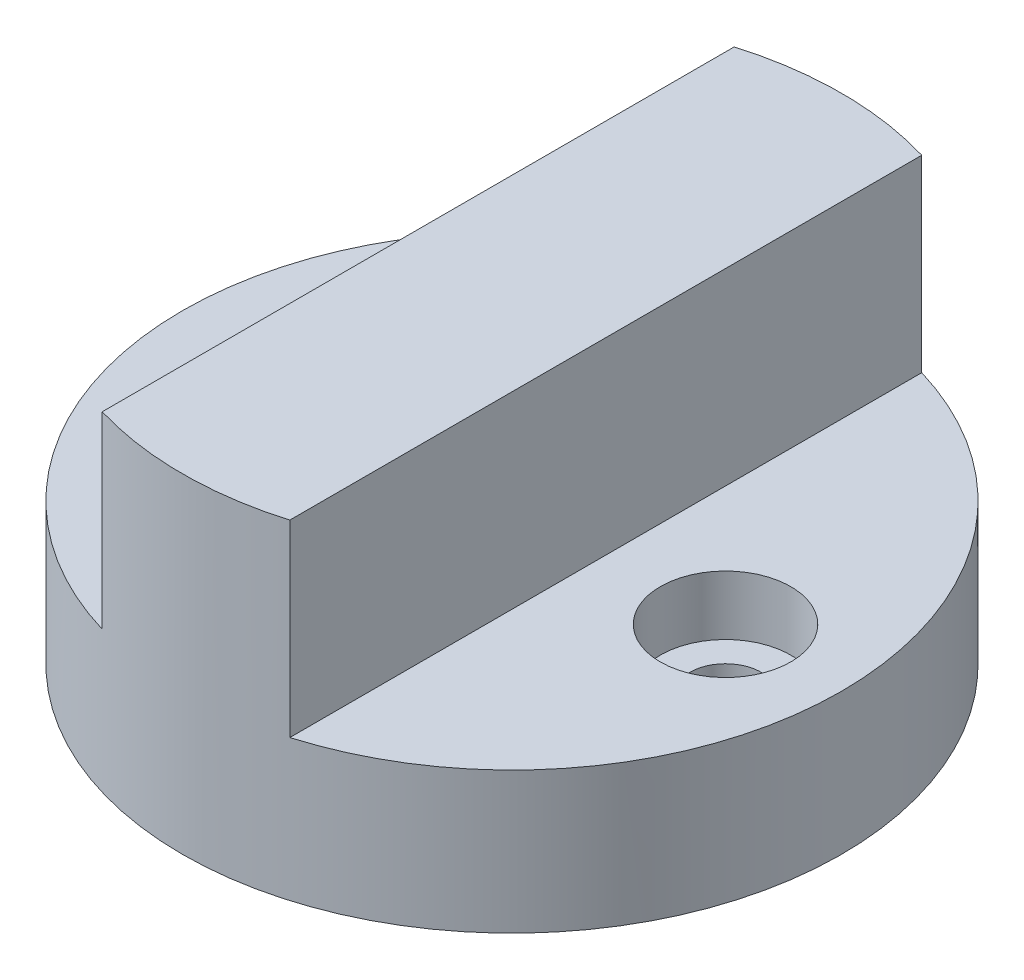
ISO-10303-21;
HEADER;
FILE_DESCRIPTION(('STEP AP214'),'2;1');
FILE_NAME('part.step','',(''),(''),'','','');
FILE_SCHEMA(('AUTOMOTIVE_DESIGN { 1 0 10303 214 1 1 1 1 }'));
ENDSEC;
DATA;
#1=APPLICATION_CONTEXT('core data for automotive mechanical design processes');
#2=APPLICATION_PROTOCOL_DEFINITION('international standard','automotive_design',2000,#1);
#3=PRODUCT_CONTEXT('',#1,'mechanical');
#4=PRODUCT('Part','Part','',(#3));
#5=PRODUCT_RELATED_PRODUCT_CATEGORY('part','',(#4));
#6=PRODUCT_DEFINITION_FORMATION('','',#4);
#7=PRODUCT_DEFINITION_CONTEXT('part definition',#1,'design');
#8=PRODUCT_DEFINITION('design','',#6,#7);
#9=PRODUCT_DEFINITION_SHAPE('','',#8);
#10=(LENGTH_UNIT() NAMED_UNIT(*) SI_UNIT(.MILLI.,.METRE.));
#11=(NAMED_UNIT(*) PLANE_ANGLE_UNIT() SI_UNIT($,.RADIAN.));
#12=(NAMED_UNIT(*) SI_UNIT($,.STERADIAN.) SOLID_ANGLE_UNIT());
#13=UNCERTAINTY_MEASURE_WITH_UNIT(LENGTH_MEASURE(1.E-05),#10,'distance_accuracy_value','');
#14=(GEOMETRIC_REPRESENTATION_CONTEXT(3) GLOBAL_UNCERTAINTY_ASSIGNED_CONTEXT((#13)) GLOBAL_UNIT_ASSIGNED_CONTEXT((#10,
#11,#12)) REPRESENTATION_CONTEXT('',''));
#15=CARTESIAN_POINT('',(0.,0.,0.));
#16=DIRECTION('',(0.,0.,1.));
#17=DIRECTION('',(1.,0.,0.));
#18=AXIS2_PLACEMENT_3D('',#15,#16,#17);
#19=CARTESIAN_POINT('',(0.,11.1125,0.));
#20=DIRECTION('',(0.,-1.,0.));
#21=DIRECTION('',(0.,0.,-1.));
#22=AXIS2_PLACEMENT_3D('',#19,#20,#21);
#23=CYLINDRICAL_SURFACE('',#22,11.1125);
#24=CARTESIAN_POINT('',(0.,11.1125,0.));
#25=DIRECTION('',(0.,1.,0.));
#26=DIRECTION('',(0.,0.,1.));
#27=AXIS2_PLACEMENT_3D('',#24,#25,#26);
#28=CIRCLE('',#27,11.1125);
#29=CARTESIAN_POINT('',(3.1623,11.1125,-10.6530519082561));
#30=VERTEX_POINT('',#29);
#31=CARTESIAN_POINT('',(-3.1623,11.1125,-10.6530519082561));
#32=VERTEX_POINT('',#31);
#33=EDGE_CURVE('E41',#30,#32,#28,.T.);
#34=ORIENTED_EDGE('',*,*,#33,.F.);
#35=DIRECTION('',(0.,1.,0.));
#36=VECTOR('',#35,1.);
#37=CARTESIAN_POINT('',(3.1623,4.7625,-10.6530519082561));
#38=LINE('',#37,#36);
#39=CARTESIAN_POINT('',(3.1623,4.7625,-10.6530519082561));
#40=VERTEX_POINT('',#39);
#41=EDGE_CURVE('E48',#40,#30,#38,.T.);
#42=ORIENTED_EDGE('',*,*,#41,.F.);
#43=CARTESIAN_POINT('',(0.,4.7625,0.));
#44=DIRECTION('',(0.,1.,0.));
#45=DIRECTION('',(0.,0.,-1.));
#46=AXIS2_PLACEMENT_3D('',#43,#44,#45);
#47=CIRCLE('',#46,11.1125);
#48=CARTESIAN_POINT('',(3.1623,4.7625,10.6530519082561));
#49=VERTEX_POINT('',#48);
#50=EDGE_CURVE('E77',#49,#40,#47,.T.);
#51=ORIENTED_EDGE('',*,*,#50,.F.);
#52=DIRECTION('',(0.,1.,0.));
#53=VECTOR('',#52,1.);
#54=CARTESIAN_POINT('',(3.1623,4.7625,10.6530519082561));
#55=LINE('',#54,#53);
#56=CARTESIAN_POINT('',(3.1623,11.1125,10.6530519082561));
#57=VERTEX_POINT('',#56);
#58=EDGE_CURVE('E85',#49,#57,#55,.T.);
#59=ORIENTED_EDGE('',*,*,#58,.T.);
#60=CARTESIAN_POINT('',(-3.1623,11.1125,10.6530519082561));
#61=VERTEX_POINT('',#60);
#62=EDGE_CURVE('E11',#61,#57,#28,.T.);
#63=ORIENTED_EDGE('',*,*,#62,.F.);
#64=DIRECTION('',(0.,1.,0.));
#65=VECTOR('',#64,1.);
#66=CARTESIAN_POINT('',(-3.1623,4.7625,10.6530519082561));
#67=LINE('',#66,#65);
#68=CARTESIAN_POINT('',(-3.1623,4.7625,10.6530519082561));
#69=VERTEX_POINT('',#68);
#70=EDGE_CURVE('E56',#69,#61,#67,.T.);
#71=ORIENTED_EDGE('',*,*,#70,.F.);
#72=CARTESIAN_POINT('',(0.,4.7625,0.));
#73=DIRECTION('',(0.,1.,0.));
#74=DIRECTION('',(0.,0.,1.));
#75=AXIS2_PLACEMENT_3D('',#72,#73,#74);
#76=CIRCLE('',#75,11.1125);
#77=CARTESIAN_POINT('',(-3.1623,4.7625,-10.6530519082561));
#78=VERTEX_POINT('',#77);
#79=EDGE_CURVE('E95',#78,#69,#76,.T.);
#80=ORIENTED_EDGE('',*,*,#79,.F.);
#81=DIRECTION('',(0.,1.,0.));
#82=VECTOR('',#81,1.);
#83=CARTESIAN_POINT('',(-3.1623,4.7625,-10.6530519082561));
#84=LINE('',#83,#82);
#85=EDGE_CURVE('E101',#78,#32,#84,.T.);
#86=ORIENTED_EDGE('',*,*,#85,.T.);
#87=EDGE_LOOP('',(#34,#42,#51,#59,#63,#71,#80,#86));
#88=FACE_BOUND('',#87,.T.);
#89=CARTESIAN_POINT('',(0.,0.,0.));
#90=DIRECTION('',(0.,1.,0.));
#91=DIRECTION('',(0.,0.,1.));
#92=AXIS2_PLACEMENT_3D('',#89,#90,#91);
#93=CIRCLE('',#92,11.1125);
#94=CARTESIAN_POINT('',(0.,0.,11.1125));
#95=VERTEX_POINT('',#94);
#96=EDGE_CURVE('E36',#95,#95,#93,.T.);
#97=ORIENTED_EDGE('',*,*,#96,.T.);
#98=EDGE_LOOP('',(#97));
#99=FACE_BOUND('',#98,.T.);
#100=ADVANCED_FACE('F33',(#88,#99),#23,.T.);
#101=CARTESIAN_POINT('',(0.,11.1125,0.));
#102=DIRECTION('',(0.,1.,0.));
#103=DIRECTION('',(0.,0.,1.));
#104=AXIS2_PLACEMENT_3D('',#101,#102,#103);
#105=PLANE('',#104);
#106=DIRECTION('',(0.,0.,1.));
#107=VECTOR('',#106,1.);
#108=CARTESIAN_POINT('',(3.1623,11.1125,-10.6530519082561));
#109=LINE('',#108,#107);
#110=EDGE_CURVE('E82',#30,#57,#109,.T.);
#111=ORIENTED_EDGE('',*,*,#110,.F.);
#112=ORIENTED_EDGE('',*,*,#33,.T.);
#113=DIRECTION('',(0.,0.,-1.));
#114=VECTOR('',#113,1.);
#115=CARTESIAN_POINT('',(-3.1623,11.1125,-10.6530519082561));
#116=LINE('',#115,#114);
#117=EDGE_CURVE('E91',#61,#32,#116,.T.);
#118=ORIENTED_EDGE('',*,*,#117,.F.);
#119=ORIENTED_EDGE('',*,*,#62,.T.);
#120=EDGE_LOOP('',(#111,#112,#118,#119));
#121=FACE_BOUND('',#120,.T.);
#122=ADVANCED_FACE('F107',(#121),#105,.T.);
#123=CARTESIAN_POINT('',(0.,0.,0.));
#124=DIRECTION('',(0.,1.,0.));
#125=DIRECTION('',(0.,0.,1.));
#126=AXIS2_PLACEMENT_3D('',#123,#124,#125);
#127=PLANE('',#126);
#128=CARTESIAN_POINT('',(-7.2,0.,0.));
#129=DIRECTION('',(0.,1.,0.));
#130=DIRECTION('',(0.,0.,1.));
#131=AXIS2_PLACEMENT_3D('',#128,#129,#130);
#132=CIRCLE('',#131,1.2);
#133=CARTESIAN_POINT('',(-7.2,0.,1.2));
#134=VERTEX_POINT('',#133);
#135=EDGE_CURVE('E139',#134,#134,#132,.T.);
#136=ORIENTED_EDGE('',*,*,#135,.T.);
#137=EDGE_LOOP('',(#136));
#138=FACE_BOUND('',#137,.T.);
#139=CARTESIAN_POINT('',(7.2,0.,0.));
#140=DIRECTION('',(0.,1.,0.));
#141=DIRECTION('',(0.,0.,1.));
#142=AXIS2_PLACEMENT_3D('',#139,#140,#141);
#143=CIRCLE('',#142,1.2);
#144=CARTESIAN_POINT('',(7.2,0.,1.2));
#145=VERTEX_POINT('',#144);
#146=EDGE_CURVE('E143',#145,#145,#143,.T.);
#147=ORIENTED_EDGE('',*,*,#146,.T.);
#148=EDGE_LOOP('',(#147));
#149=FACE_BOUND('',#148,.T.);
#150=ORIENTED_EDGE('',*,*,#96,.F.);
#151=EDGE_LOOP('',(#150));
#152=FACE_BOUND('',#151,.T.);
#153=ADVANCED_FACE('F122',(#138,#149,#152),#127,.F.);
#154=CARTESIAN_POINT('',(-3.1623,4.7625,-10.6530519082561));
#155=DIRECTION('',(1.,0.,0.));
#156=DIRECTION('',(0.,0.,-1.));
#157=AXIS2_PLACEMENT_3D('',#154,#155,#156);
#158=PLANE('',#157);
#159=ORIENTED_EDGE('',*,*,#117,.T.);
#160=ORIENTED_EDGE('',*,*,#85,.F.);
#161=DIRECTION('',(0.,0.,-1.));
#162=VECTOR('',#161,1.);
#163=CARTESIAN_POINT('',(-3.1623,4.7625,-10.6530519082561));
#164=LINE('',#163,#162);
#165=EDGE_CURVE('E97',#69,#78,#164,.T.);
#166=ORIENTED_EDGE('',*,*,#165,.F.);
#167=ORIENTED_EDGE('',*,*,#70,.T.);
#168=EDGE_LOOP('',(#159,#160,#166,#167));
#169=FACE_BOUND('',#168,.T.);
#170=ADVANCED_FACE('F109',(#169),#158,.F.);
#171=CARTESIAN_POINT('',(0.,4.7625,0.));
#172=DIRECTION('',(0.,1.,0.));
#173=DIRECTION('',(0.,0.,1.));
#174=AXIS2_PLACEMENT_3D('',#171,#172,#173);
#175=PLANE('',#174);
#176=CARTESIAN_POINT('',(-7.2,4.7625,0.));
#177=DIRECTION('',(0.,1.,0.));
#178=DIRECTION('',(0.,0.,1.));
#179=AXIS2_PLACEMENT_3D('',#176,#177,#178);
#180=CIRCLE('',#179,2.2);
#181=CARTESIAN_POINT('',(-7.2,4.7625,2.2));
#182=VERTEX_POINT('',#181);
#183=EDGE_CURVE('E163',#182,#182,#180,.T.);
#184=ORIENTED_EDGE('',*,*,#183,.F.);
#185=EDGE_LOOP('',(#184));
#186=FACE_BOUND('',#185,.T.);
#187=ORIENTED_EDGE('',*,*,#79,.T.);
#188=ORIENTED_EDGE('',*,*,#165,.T.);
#189=EDGE_LOOP('',(#187,#188));
#190=FACE_BOUND('',#189,.T.);
#191=ADVANCED_FACE('F111',(#186,#190),#175,.T.);
#192=CARTESIAN_POINT('',(3.1623,4.7625,-10.6530519082561));
#193=DIRECTION('',(-1.,0.,0.));
#194=DIRECTION('',(0.,0.,1.));
#195=AXIS2_PLACEMENT_3D('',#192,#193,#194);
#196=PLANE('',#195);
#197=ORIENTED_EDGE('',*,*,#110,.T.);
#198=ORIENTED_EDGE('',*,*,#58,.F.);
#199=DIRECTION('',(0.,0.,1.));
#200=VECTOR('',#199,1.);
#201=CARTESIAN_POINT('',(3.1623,4.7625,-10.6530519082561));
#202=LINE('',#201,#200);
#203=EDGE_CURVE('E79',#40,#49,#202,.T.);
#204=ORIENTED_EDGE('',*,*,#203,.F.);
#205=ORIENTED_EDGE('',*,*,#41,.T.);
#206=EDGE_LOOP('',(#197,#198,#204,#205));
#207=FACE_BOUND('',#206,.T.);
#208=ADVANCED_FACE('F84',(#207),#196,.F.);
#209=CARTESIAN_POINT('',(0.,4.7625,0.));
#210=DIRECTION('',(0.,-1.,0.));
#211=DIRECTION('',(0.,0.,-1.));
#212=AXIS2_PLACEMENT_3D('',#209,#210,#211);
#213=PLANE('',#212);
#214=CARTESIAN_POINT('',(7.2,4.7625,0.));
#215=DIRECTION('',(0.,1.,0.));
#216=DIRECTION('',(0.,0.,1.));
#217=AXIS2_PLACEMENT_3D('',#214,#215,#216);
#218=CIRCLE('',#217,2.2);
#219=CARTESIAN_POINT('',(7.2,4.7625,2.2));
#220=VERTEX_POINT('',#219);
#221=EDGE_CURVE('E153',#220,#220,#218,.T.);
#222=ORIENTED_EDGE('',*,*,#221,.F.);
#223=EDGE_LOOP('',(#222));
#224=FACE_BOUND('',#223,.T.);
#225=ORIENTED_EDGE('',*,*,#50,.T.);
#226=ORIENTED_EDGE('',*,*,#203,.T.);
#227=EDGE_LOOP('',(#225,#226));
#228=FACE_BOUND('',#227,.T.);
#229=ADVANCED_FACE('F78',(#224,#228),#213,.F.);
#230=CARTESIAN_POINT('',(7.2,4.7625,0.));
#231=DIRECTION('',(0.,1.,0.));
#232=DIRECTION('',(0.,0.,1.));
#233=AXIS2_PLACEMENT_3D('',#230,#231,#232);
#234=CYLINDRICAL_SURFACE('',#233,1.2);
#235=ORIENTED_EDGE('',*,*,#146,.F.);
#236=EDGE_LOOP('',(#235));
#237=FACE_BOUND('',#236,.T.);
#238=CARTESIAN_POINT('',(7.2,2.7625,0.));
#239=DIRECTION('',(0.,1.,0.));
#240=DIRECTION('',(0.,0.,1.));
#241=AXIS2_PLACEMENT_3D('',#238,#239,#240);
#242=CIRCLE('',#241,1.2);
#243=CARTESIAN_POINT('',(7.2,2.7625,1.2));
#244=VERTEX_POINT('',#243);
#245=EDGE_CURVE('E145',#244,#244,#242,.T.);
#246=ORIENTED_EDGE('',*,*,#245,.T.);
#247=EDGE_LOOP('',(#246));
#248=FACE_BOUND('',#247,.T.);
#249=ADVANCED_FACE('F189',(#237,#248),#234,.F.);
#250=CARTESIAN_POINT('',(8.4,2.7625,0.));
#251=DIRECTION('',(0.,-1.,0.));
#252=DIRECTION('',(0.,0.,-1.));
#253=AXIS2_PLACEMENT_3D('',#250,#251,#252);
#254=PLANE('',#253);
#255=ORIENTED_EDGE('',*,*,#245,.F.);
#256=EDGE_LOOP('',(#255));
#257=FACE_BOUND('',#256,.T.);
#258=CARTESIAN_POINT('',(7.2,2.7625,0.));
#259=DIRECTION('',(0.,1.,0.));
#260=DIRECTION('',(0.,0.,1.));
#261=AXIS2_PLACEMENT_3D('',#258,#259,#260);
#262=CIRCLE('',#261,2.2);
#263=CARTESIAN_POINT('',(7.2,2.7625,2.2));
#264=VERTEX_POINT('',#263);
#265=EDGE_CURVE('E148',#264,#264,#262,.T.);
#266=ORIENTED_EDGE('',*,*,#265,.T.);
#267=EDGE_LOOP('',(#266));
#268=FACE_BOUND('',#267,.T.);
#269=ADVANCED_FACE('F185',(#257,#268),#254,.F.);
#270=CARTESIAN_POINT('',(7.2,4.7625,0.));
#271=DIRECTION('',(0.,1.,0.));
#272=DIRECTION('',(0.,0.,1.));
#273=AXIS2_PLACEMENT_3D('',#270,#271,#272);
#274=CYLINDRICAL_SURFACE('',#273,2.2);
#275=ORIENTED_EDGE('',*,*,#265,.F.);
#276=EDGE_LOOP('',(#275));
#277=FACE_BOUND('',#276,.T.);
#278=ORIENTED_EDGE('',*,*,#221,.T.);
#279=EDGE_LOOP('',(#278));
#280=FACE_BOUND('',#279,.T.);
#281=ADVANCED_FACE('F181',(#277,#280),#274,.F.);
#282=CARTESIAN_POINT('',(-7.2,4.7625,0.));
#283=DIRECTION('',(0.,1.,0.));
#284=DIRECTION('',(0.,0.,1.));
#285=AXIS2_PLACEMENT_3D('',#282,#283,#284);
#286=CYLINDRICAL_SURFACE('',#285,1.2);
#287=ORIENTED_EDGE('',*,*,#135,.F.);
#288=EDGE_LOOP('',(#287));
#289=FACE_BOUND('',#288,.T.);
#290=CARTESIAN_POINT('',(-7.2,2.7625,0.));
#291=DIRECTION('',(0.,1.,0.));
#292=DIRECTION('',(0.,0.,1.));
#293=AXIS2_PLACEMENT_3D('',#290,#291,#292);
#294=CIRCLE('',#293,1.2);
#295=CARTESIAN_POINT('',(-7.2,2.7625,1.2));
#296=VERTEX_POINT('',#295);
#297=EDGE_CURVE('E157',#296,#296,#294,.T.);
#298=ORIENTED_EDGE('',*,*,#297,.T.);
#299=EDGE_LOOP('',(#298));
#300=FACE_BOUND('',#299,.T.);
#301=ADVANCED_FACE('F174',(#289,#300),#286,.F.);
#302=CARTESIAN_POINT('',(-6.,2.7625,0.));
#303=DIRECTION('',(0.,-1.,0.));
#304=DIRECTION('',(0.,0.,-1.));
#305=AXIS2_PLACEMENT_3D('',#302,#303,#304);
#306=PLANE('',#305);
#307=ORIENTED_EDGE('',*,*,#297,.F.);
#308=EDGE_LOOP('',(#307));
#309=FACE_BOUND('',#308,.T.);
#310=CARTESIAN_POINT('',(-7.2,2.7625,0.));
#311=DIRECTION('',(0.,1.,0.));
#312=DIRECTION('',(0.,0.,1.));
#313=AXIS2_PLACEMENT_3D('',#310,#311,#312);
#314=CIRCLE('',#313,2.2);
#315=CARTESIAN_POINT('',(-7.2,2.7625,2.2));
#316=VERTEX_POINT('',#315);
#317=EDGE_CURVE('E160',#316,#316,#314,.T.);
#318=ORIENTED_EDGE('',*,*,#317,.T.);
#319=EDGE_LOOP('',(#318));
#320=FACE_BOUND('',#319,.T.);
#321=ADVANCED_FACE('F168',(#309,#320),#306,.F.);
#322=CARTESIAN_POINT('',(-7.2,4.7625,0.));
#323=DIRECTION('',(0.,1.,0.));
#324=DIRECTION('',(0.,0.,1.));
#325=AXIS2_PLACEMENT_3D('',#322,#323,#324);
#326=CYLINDRICAL_SURFACE('',#325,2.2);
#327=ORIENTED_EDGE('',*,*,#317,.F.);
#328=EDGE_LOOP('',(#327));
#329=FACE_BOUND('',#328,.T.);
#330=ORIENTED_EDGE('',*,*,#183,.T.);
#331=EDGE_LOOP('',(#330));
#332=FACE_BOUND('',#331,.T.);
#333=ADVANCED_FACE('F166',(#329,#332),#326,.F.);
#334=CLOSED_SHELL('',(#100,#122,#153,#170,#191,#208,#229,#249,#269,#281,#301,#321,#333));
#335=MANIFOLD_SOLID_BREP('B2',#334);
#336=ADVANCED_BREP_SHAPE_REPRESENTATION('',(#18,#335),#14);
#337=SHAPE_DEFINITION_REPRESENTATION(#9,#336);
ENDSEC;
END-ISO-10303-21;
